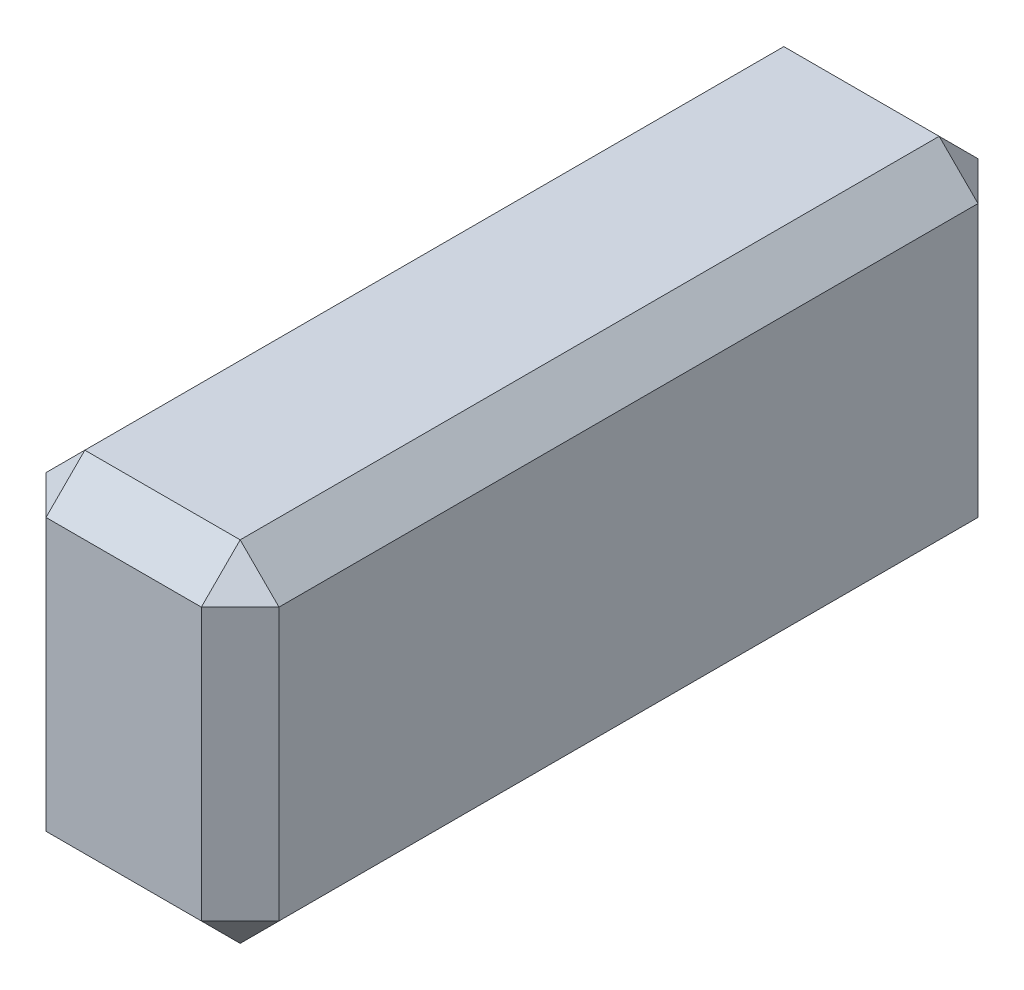
ISO-10303-21;
HEADER;
FILE_DESCRIPTION(('STEP AP214'),'2;1');
FILE_NAME('part.step','',(''),(''),'','','');
FILE_SCHEMA(('AUTOMOTIVE_DESIGN { 1 0 10303 214 1 1 1 1 }'));
ENDSEC;
DATA;
#1=APPLICATION_CONTEXT('core data for automotive mechanical design processes');
#2=APPLICATION_PROTOCOL_DEFINITION('international standard','automotive_design',2000,#1);
#3=PRODUCT_CONTEXT('',#1,'mechanical');
#4=PRODUCT('Part','Part','',(#3));
#5=PRODUCT_RELATED_PRODUCT_CATEGORY('part','',(#4));
#6=PRODUCT_DEFINITION_FORMATION('','',#4);
#7=PRODUCT_DEFINITION_CONTEXT('part definition',#1,'design');
#8=PRODUCT_DEFINITION('design','',#6,#7);
#9=PRODUCT_DEFINITION_SHAPE('','',#8);
#10=(LENGTH_UNIT() NAMED_UNIT(*) SI_UNIT(.MILLI.,.METRE.));
#11=(NAMED_UNIT(*) PLANE_ANGLE_UNIT() SI_UNIT($,.RADIAN.));
#12=(NAMED_UNIT(*) SI_UNIT($,.STERADIAN.) SOLID_ANGLE_UNIT());
#13=UNCERTAINTY_MEASURE_WITH_UNIT(LENGTH_MEASURE(1.E-05),#10,'distance_accuracy_value','');
#14=(GEOMETRIC_REPRESENTATION_CONTEXT(3) GLOBAL_UNCERTAINTY_ASSIGNED_CONTEXT((#13)) GLOBAL_UNIT_ASSIGNED_CONTEXT((#10,
#11,#12)) REPRESENTATION_CONTEXT('',''));
#15=CARTESIAN_POINT('',(0.,0.,0.));
#16=DIRECTION('',(0.,0.,1.));
#17=DIRECTION('',(1.,0.,0.));
#18=AXIS2_PLACEMENT_3D('',#15,#16,#17);
#19=CARTESIAN_POINT('',(1.5,-2.25,10.));
#20=DIRECTION('',(-1.,0.,0.));
#21=DIRECTION('',(0.,-1.,0.));
#22=AXIS2_PLACEMENT_3D('',#19,#20,#21);
#23=PLANE('',#22);
#24=DIRECTION('',(0.,-1.,0.));
#25=VECTOR('',#24,1.);
#26=CARTESIAN_POINT('',(1.5,-2.25,9.5));
#27=LINE('',#26,#25);
#28=CARTESIAN_POINT('',(1.5,1.75,9.5));
#29=VERTEX_POINT('',#28);
#30=CARTESIAN_POINT('',(1.5,-1.75,9.5));
#31=VERTEX_POINT('',#30);
#32=EDGE_CURVE('E51',#29,#31,#27,.T.);
#33=ORIENTED_EDGE('',*,*,#32,.T.);
#34=DIRECTION('',(0.,0.,-1.));
#35=VECTOR('',#34,1.);
#36=CARTESIAN_POINT('',(1.5,-1.75,10.));
#37=LINE('',#36,#35);
#38=CARTESIAN_POINT('',(1.5,-1.75,0.5));
#39=VERTEX_POINT('',#38);
#40=EDGE_CURVE('E11',#31,#39,#37,.T.);
#41=ORIENTED_EDGE('',*,*,#40,.T.);
#42=DIRECTION('',(0.,1.,0.));
#43=VECTOR('',#42,1.);
#44=CARTESIAN_POINT('',(1.5,2.25,0.5));
#45=LINE('',#44,#43);
#46=CARTESIAN_POINT('',(1.5,1.75,0.5));
#47=VERTEX_POINT('',#46);
#48=EDGE_CURVE('E203',#39,#47,#45,.T.);
#49=ORIENTED_EDGE('',*,*,#48,.T.);
#50=DIRECTION('',(0.,0.,1.));
#51=VECTOR('',#50,1.);
#52=CARTESIAN_POINT('',(1.5,1.75,10.));
#53=LINE('',#52,#51);
#54=EDGE_CURVE('E62',#47,#29,#53,.T.);
#55=ORIENTED_EDGE('',*,*,#54,.T.);
#56=EDGE_LOOP('',(#33,#41,#49,#55));
#57=FACE_BOUND('',#56,.T.);
#58=ADVANCED_FACE('F41',(#57),#23,.F.);
#59=CARTESIAN_POINT('',(-1.5,2.25,10.));
#60=DIRECTION('',(0.,-1.,0.));
#61=DIRECTION('',(1.,0.,0.));
#62=AXIS2_PLACEMENT_3D('',#59,#60,#61);
#63=PLANE('',#62);
#64=DIRECTION('',(0.,0.,1.));
#65=VECTOR('',#64,1.);
#66=CARTESIAN_POINT('',(-0.999999999999999,2.25,10.));
#67=LINE('',#66,#65);
#68=CARTESIAN_POINT('',(-0.999999999999999,2.25,0.5));
#69=VERTEX_POINT('',#68);
#70=CARTESIAN_POINT('',(-0.999999999999999,2.25,9.5));
#71=VERTEX_POINT('',#70);
#72=EDGE_CURVE('E189',#69,#71,#67,.T.);
#73=ORIENTED_EDGE('',*,*,#72,.T.);
#74=DIRECTION('',(1.,0.,0.));
#75=VECTOR('',#74,1.);
#76=CARTESIAN_POINT('',(-1.5,2.25,9.5));
#77=LINE('',#76,#75);
#78=CARTESIAN_POINT('',(0.999999999999998,2.25,9.5));
#79=VERTEX_POINT('',#78);
#80=EDGE_CURVE('E191',#71,#79,#77,.T.);
#81=ORIENTED_EDGE('',*,*,#80,.T.);
#82=DIRECTION('',(0.,0.,-1.));
#83=VECTOR('',#82,1.);
#84=CARTESIAN_POINT('',(0.999999999999998,2.25,10.));
#85=LINE('',#84,#83);
#86=CARTESIAN_POINT('',(0.999999999999998,2.25,0.5));
#87=VERTEX_POINT('',#86);
#88=EDGE_CURVE('E185',#79,#87,#85,.T.);
#89=ORIENTED_EDGE('',*,*,#88,.T.);
#90=DIRECTION('',(-1.,0.,0.));
#91=VECTOR('',#90,1.);
#92=CARTESIAN_POINT('',(-1.5,2.25,0.5));
#93=LINE('',#92,#91);
#94=EDGE_CURVE('E187',#87,#69,#93,.T.);
#95=ORIENTED_EDGE('',*,*,#94,.T.);
#96=EDGE_LOOP('',(#73,#81,#89,#95));
#97=FACE_BOUND('',#96,.T.);
#98=ADVANCED_FACE('F322',(#97),#63,.F.);
#99=CARTESIAN_POINT('',(-1.5,-2.25,10.));
#100=DIRECTION('',(1.,0.,0.));
#101=DIRECTION('',(0.,0.,-1.));
#102=AXIS2_PLACEMENT_3D('',#99,#100,#101);
#103=PLANE('',#102);
#104=DIRECTION('',(0.,1.,0.));
#105=VECTOR('',#104,1.);
#106=CARTESIAN_POINT('',(-1.5,-2.25,9.5));
#107=LINE('',#106,#105);
#108=CARTESIAN_POINT('',(-1.5,-1.75,9.5));
#109=VERTEX_POINT('',#108);
#110=CARTESIAN_POINT('',(-1.5,1.75,9.5));
#111=VERTEX_POINT('',#110);
#112=EDGE_CURVE('E198',#109,#111,#107,.T.);
#113=ORIENTED_EDGE('',*,*,#112,.T.);
#114=DIRECTION('',(0.,0.,-1.));
#115=VECTOR('',#114,1.);
#116=CARTESIAN_POINT('',(-1.5,1.75,10.));
#117=LINE('',#116,#115);
#118=CARTESIAN_POINT('',(-1.5,1.75,0.5));
#119=VERTEX_POINT('',#118);
#120=EDGE_CURVE('E200',#111,#119,#117,.T.);
#121=ORIENTED_EDGE('',*,*,#120,.T.);
#122=DIRECTION('',(0.,-1.,0.));
#123=VECTOR('',#122,1.);
#124=CARTESIAN_POINT('',(-1.5,-2.25,0.5));
#125=LINE('',#124,#123);
#126=CARTESIAN_POINT('',(-1.5,-1.75,0.5));
#127=VERTEX_POINT('',#126);
#128=EDGE_CURVE('E194',#119,#127,#125,.T.);
#129=ORIENTED_EDGE('',*,*,#128,.T.);
#130=DIRECTION('',(0.,0.,1.));
#131=VECTOR('',#130,1.);
#132=CARTESIAN_POINT('',(-1.5,-1.75,10.));
#133=LINE('',#132,#131);
#134=EDGE_CURVE('E196',#127,#109,#133,.T.);
#135=ORIENTED_EDGE('',*,*,#134,.T.);
#136=EDGE_LOOP('',(#113,#121,#129,#135));
#137=FACE_BOUND('',#136,.T.);
#138=ADVANCED_FACE('F278',(#137),#103,.F.);
#139=CARTESIAN_POINT('',(-1.5,-2.25,10.));
#140=DIRECTION('',(0.,1.,0.));
#141=DIRECTION('',(-1.,0.,0.));
#142=AXIS2_PLACEMENT_3D('',#139,#140,#141);
#143=PLANE('',#142);
#144=DIRECTION('',(-1.,0.,0.));
#145=VECTOR('',#144,1.);
#146=CARTESIAN_POINT('',(-1.5,-2.25,9.5));
#147=LINE('',#146,#145);
#148=CARTESIAN_POINT('',(0.999999999999997,-2.25,9.5));
#149=VERTEX_POINT('',#148);
#150=CARTESIAN_POINT('',(-1.,-2.25,9.5));
#151=VERTEX_POINT('',#150);
#152=EDGE_CURVE('E138',#149,#151,#147,.T.);
#153=ORIENTED_EDGE('',*,*,#152,.T.);
#154=DIRECTION('',(0.,0.,-1.));
#155=VECTOR('',#154,1.);
#156=CARTESIAN_POINT('',(-1.,-2.25,10.));
#157=LINE('',#156,#155);
#158=CARTESIAN_POINT('',(-1.,-2.25,0.5));
#159=VERTEX_POINT('',#158);
#160=EDGE_CURVE('E174',#151,#159,#157,.T.);
#161=ORIENTED_EDGE('',*,*,#160,.T.);
#162=DIRECTION('',(1.,0.,0.));
#163=VECTOR('',#162,1.);
#164=CARTESIAN_POINT('',(1.5,-2.25,0.5));
#165=LINE('',#164,#163);
#166=CARTESIAN_POINT('',(0.999999999999997,-2.25,0.5));
#167=VERTEX_POINT('',#166);
#168=EDGE_CURVE('E171',#159,#167,#165,.T.);
#169=ORIENTED_EDGE('',*,*,#168,.T.);
#170=DIRECTION('',(0.,0.,1.));
#171=VECTOR('',#170,1.);
#172=CARTESIAN_POINT('',(0.999999999999997,-2.25,10.));
#173=LINE('',#172,#171);
#174=EDGE_CURVE('E166',#167,#149,#173,.T.);
#175=ORIENTED_EDGE('',*,*,#174,.T.);
#176=EDGE_LOOP('',(#153,#161,#169,#175));
#177=FACE_BOUND('',#176,.T.);
#178=ADVANCED_FACE('F300',(#177),#143,.F.);
#179=CARTESIAN_POINT('',(0.,0.,10.));
#180=DIRECTION('',(0.,0.,-1.));
#181=DIRECTION('',(-1.,0.,0.));
#182=AXIS2_PLACEMENT_3D('',#179,#180,#181);
#183=PLANE('',#182);
#184=DIRECTION('',(-1.,0.,0.));
#185=VECTOR('',#184,1.);
#186=CARTESIAN_POINT('',(0.,1.75,10.));
#187=LINE('',#186,#185);
#188=CARTESIAN_POINT('',(0.999999999999998,1.75,10.));
#189=VERTEX_POINT('',#188);
#190=CARTESIAN_POINT('',(-1.,1.75,10.));
#191=VERTEX_POINT('',#190);
#192=EDGE_CURVE('E159',#189,#191,#187,.T.);
#193=ORIENTED_EDGE('',*,*,#192,.T.);
#194=DIRECTION('',(0.,-1.,0.));
#195=VECTOR('',#194,1.);
#196=CARTESIAN_POINT('',(-1.,0.,10.));
#197=LINE('',#196,#195);
#198=CARTESIAN_POINT('',(-1.,-1.75,10.));
#199=VERTEX_POINT('',#198);
#200=EDGE_CURVE('E163',#191,#199,#197,.T.);
#201=ORIENTED_EDGE('',*,*,#200,.T.);
#202=DIRECTION('',(1.,0.,0.));
#203=VECTOR('',#202,1.);
#204=CARTESIAN_POINT('',(0.,-1.75,10.));
#205=LINE('',#204,#203);
#206=CARTESIAN_POINT('',(0.999999999999997,-1.75,10.));
#207=VERTEX_POINT('',#206);
#208=EDGE_CURVE('E136',#199,#207,#205,.T.);
#209=ORIENTED_EDGE('',*,*,#208,.T.);
#210=DIRECTION('',(0.,1.,0.));
#211=VECTOR('',#210,1.);
#212=CARTESIAN_POINT('',(0.999999999999997,0.,10.));
#213=LINE('',#212,#211);
#214=EDGE_CURVE('E153',#207,#189,#213,.T.);
#215=ORIENTED_EDGE('',*,*,#214,.T.);
#216=EDGE_LOOP('',(#193,#201,#209,#215));
#217=FACE_BOUND('',#216,.T.);
#218=ADVANCED_FACE('F161',(#217),#183,.F.);
#219=CARTESIAN_POINT('',(0.,0.,0.));
#220=DIRECTION('',(0.,0.,-1.));
#221=DIRECTION('',(-1.,0.,0.));
#222=AXIS2_PLACEMENT_3D('',#219,#220,#221);
#223=PLANE('',#222);
#224=DIRECTION('',(0.,-1.,0.));
#225=VECTOR('',#224,1.);
#226=CARTESIAN_POINT('',(0.999999999999997,-2.25,0.));
#227=LINE('',#226,#225);
#228=CARTESIAN_POINT('',(0.999999999999998,1.75,0.));
#229=VERTEX_POINT('',#228);
#230=CARTESIAN_POINT('',(0.999999999999997,-1.75,0.));
#231=VERTEX_POINT('',#230);
#232=EDGE_CURVE('E176',#229,#231,#227,.T.);
#233=ORIENTED_EDGE('',*,*,#232,.T.);
#234=DIRECTION('',(-1.,0.,0.));
#235=VECTOR('',#234,1.);
#236=CARTESIAN_POINT('',(-1.5,-1.75,0.));
#237=LINE('',#236,#235);
#238=CARTESIAN_POINT('',(-0.999999999999999,-1.75,0.));
#239=VERTEX_POINT('',#238);
#240=EDGE_CURVE('E182',#231,#239,#237,.T.);
#241=ORIENTED_EDGE('',*,*,#240,.T.);
#242=DIRECTION('',(0.,1.,0.));
#243=VECTOR('',#242,1.);
#244=CARTESIAN_POINT('',(-0.999999999999999,2.25,0.));
#245=LINE('',#244,#243);
#246=CARTESIAN_POINT('',(-0.999999999999999,1.75,0.));
#247=VERTEX_POINT('',#246);
#248=EDGE_CURVE('E180',#239,#247,#245,.T.);
#249=ORIENTED_EDGE('',*,*,#248,.T.);
#250=DIRECTION('',(1.,0.,0.));
#251=VECTOR('',#250,1.);
#252=CARTESIAN_POINT('',(1.5,1.75,0.));
#253=LINE('',#252,#251);
#254=EDGE_CURVE('E178',#247,#229,#253,.T.);
#255=ORIENTED_EDGE('',*,*,#254,.T.);
#256=EDGE_LOOP('',(#233,#241,#249,#255));
#257=FACE_BOUND('',#256,.T.);
#258=ADVANCED_FACE('F324',(#257),#223,.T.);
#259=CARTESIAN_POINT('',(-1.5,2.25,0.5));
#260=DIRECTION('',(0.,0.707106781186546,-0.707106781186549));
#261=DIRECTION('',(1.,0.,0.));
#262=AXIS2_PLACEMENT_3D('',#259,#260,#261);
#263=PLANE('',#262);
#264=DIRECTION('',(0.,-0.707106781186549,-0.707106781186546));
#265=VECTOR('',#264,1.);
#266=CARTESIAN_POINT('',(-0.999999999999999,2.,0.25));
#267=LINE('',#266,#265);
#268=EDGE_CURVE('E46',#69,#247,#267,.T.);
#269=ORIENTED_EDGE('',*,*,#268,.F.);
#270=ORIENTED_EDGE('',*,*,#94,.F.);
#271=DIRECTION('',(0.,0.707106781186549,0.707106781186546));
#272=VECTOR('',#271,1.);
#273=CARTESIAN_POINT('',(0.999999999999998,1.75,0.));
#274=LINE('',#273,#272);
#275=EDGE_CURVE('E256',#229,#87,#274,.T.);
#276=ORIENTED_EDGE('',*,*,#275,.F.);
#277=ORIENTED_EDGE('',*,*,#254,.F.);
#278=EDGE_LOOP('',(#269,#270,#276,#277));
#279=FACE_BOUND('',#278,.T.);
#280=ADVANCED_FACE('F44',(#279),#263,.T.);
#281=CARTESIAN_POINT('',(-1.5,1.75,0.5));
#282=DIRECTION('',(-0.577350269189624,0.577350269189626,-0.577350269189628));
#283=DIRECTION('',(0.,0.707106781186549,0.707106781186546));
#284=AXIS2_PLACEMENT_3D('',#281,#282,#283);
#285=PLANE('',#284);
#286=DIRECTION('',(-0.707106781186549,-0.707106781186546,0.));
#287=VECTOR('',#286,1.);
#288=CARTESIAN_POINT('',(-1.5,1.75,0.5));
#289=LINE('',#288,#287);
#290=EDGE_CURVE('E251',#69,#119,#289,.T.);
#291=ORIENTED_EDGE('',*,*,#290,.F.);
#292=ORIENTED_EDGE('',*,*,#268,.T.);
#293=DIRECTION('',(-0.707106781186549,0.,0.707106781186546));
#294=VECTOR('',#293,1.);
#295=CARTESIAN_POINT('',(-1.5,1.75,0.5));
#296=LINE('',#295,#294);
#297=EDGE_CURVE('E254',#119,#247,#296,.F.);
#298=ORIENTED_EDGE('',*,*,#297,.F.);
#299=EDGE_LOOP('',(#291,#292,#298));
#300=FACE_BOUND('',#299,.T.);
#301=ADVANCED_FACE('F267',(#300),#285,.T.);
#302=CARTESIAN_POINT('',(0.999999999999998,1.75,0.));
#303=DIRECTION('',(0.577350269189625,0.577350269189626,-0.577350269189627));
#304=DIRECTION('',(0.,0.707106781186549,0.707106781186546));
#305=AXIS2_PLACEMENT_3D('',#302,#303,#304);
#306=PLANE('',#305);
#307=DIRECTION('',(-0.707106781186549,0.,-0.707106781186546));
#308=VECTOR('',#307,1.);
#309=CARTESIAN_POINT('',(0.999999999999998,1.75,0.));
#310=LINE('',#309,#308);
#311=EDGE_CURVE('E245',#229,#47,#310,.F.);
#312=ORIENTED_EDGE('',*,*,#311,.F.);
#313=ORIENTED_EDGE('',*,*,#275,.T.);
#314=DIRECTION('',(-0.707106781186548,0.707106781186547,0.));
#315=VECTOR('',#314,1.);
#316=CARTESIAN_POINT('',(1.25,2.,0.500000000000001));
#317=LINE('',#316,#315);
#318=EDGE_CURVE('E248',#47,#87,#317,.T.);
#319=ORIENTED_EDGE('',*,*,#318,.F.);
#320=EDGE_LOOP('',(#312,#313,#319));
#321=FACE_BOUND('',#320,.T.);
#322=ADVANCED_FACE('F311',(#321),#306,.T.);
#323=CARTESIAN_POINT('',(-1.5,-2.25,0.5));
#324=DIRECTION('',(-0.707106781186546,0.,-0.707106781186549));
#325=DIRECTION('',(0.,1.,0.));
#326=AXIS2_PLACEMENT_3D('',#323,#324,#325);
#327=PLANE('',#326);
#328=ORIENTED_EDGE('',*,*,#297,.T.);
#329=ORIENTED_EDGE('',*,*,#248,.F.);
#330=DIRECTION('',(0.707106781186549,0.,-0.707106781186546));
#331=VECTOR('',#330,1.);
#332=CARTESIAN_POINT('',(-0.999999999999999,-1.75,0.));
#333=LINE('',#332,#331);
#334=EDGE_CURVE('E240',#127,#239,#333,.T.);
#335=ORIENTED_EDGE('',*,*,#334,.F.);
#336=ORIENTED_EDGE('',*,*,#128,.F.);
#337=EDGE_LOOP('',(#328,#329,#335,#336));
#338=FACE_BOUND('',#337,.T.);
#339=ADVANCED_FACE('F274',(#338),#327,.T.);
#340=CARTESIAN_POINT('',(-1.5,1.75,10.));
#341=DIRECTION('',(0.707106781186546,-0.707106781186549,0.));
#342=DIRECTION('',(0.,0.,-1.));
#343=AXIS2_PLACEMENT_3D('',#340,#341,#342);
#344=PLANE('',#343);
#345=ORIENTED_EDGE('',*,*,#290,.T.);
#346=ORIENTED_EDGE('',*,*,#120,.F.);
#347=DIRECTION('',(0.707106781186549,0.707106781186546,0.));
#348=VECTOR('',#347,1.);
#349=CARTESIAN_POINT('',(-1.25,2.,9.5));
#350=LINE('',#349,#348);
#351=EDGE_CURVE('E237',#71,#111,#350,.F.);
#352=ORIENTED_EDGE('',*,*,#351,.F.);
#353=ORIENTED_EDGE('',*,*,#72,.F.);
#354=EDGE_LOOP('',(#345,#346,#352,#353));
#355=FACE_BOUND('',#354,.T.);
#356=ADVANCED_FACE('F284',(#355),#344,.F.);
#357=CARTESIAN_POINT('',(0.,1.75,10.));
#358=DIRECTION('',(0.,-0.707106781186549,-0.707106781186546));
#359=DIRECTION('',(-1.,0.,0.));
#360=AXIS2_PLACEMENT_3D('',#357,#358,#359);
#361=PLANE('',#360);
#362=DIRECTION('',(0.,0.707106781186546,-0.707106781186549));
#363=VECTOR('',#362,1.);
#364=CARTESIAN_POINT('',(0.999999999999998,2.25,9.5));
#365=LINE('',#364,#363);
#366=EDGE_CURVE('E231',#79,#189,#365,.F.);
#367=ORIENTED_EDGE('',*,*,#366,.F.);
#368=ORIENTED_EDGE('',*,*,#80,.F.);
#369=DIRECTION('',(0.,-0.707106781186546,0.707106781186549));
#370=VECTOR('',#369,1.);
#371=CARTESIAN_POINT('',(-1.,1.75,10.));
#372=LINE('',#371,#370);
#373=EDGE_CURVE('E234',#191,#71,#372,.F.);
#374=ORIENTED_EDGE('',*,*,#373,.F.);
#375=ORIENTED_EDGE('',*,*,#192,.F.);
#376=EDGE_LOOP('',(#367,#368,#374,#375));
#377=FACE_BOUND('',#376,.T.);
#378=ADVANCED_FACE('F320',(#377),#361,.F.);
#379=CARTESIAN_POINT('',(0.999999999999998,2.25,10.));
#380=DIRECTION('',(-0.707106781186547,-0.707106781186548,0.));
#381=DIRECTION('',(0.,0.,-1.));
#382=AXIS2_PLACEMENT_3D('',#379,#380,#381);
#383=PLANE('',#382);
#384=ORIENTED_EDGE('',*,*,#318,.T.);
#385=ORIENTED_EDGE('',*,*,#88,.F.);
#386=DIRECTION('',(0.707106781186548,-0.707106781186547,0.));
#387=VECTOR('',#386,1.);
#388=CARTESIAN_POINT('',(0.999999999999998,2.25,9.5));
#389=LINE('',#388,#387);
#390=EDGE_CURVE('E229',#29,#79,#389,.F.);
#391=ORIENTED_EDGE('',*,*,#390,.F.);
#392=ORIENTED_EDGE('',*,*,#54,.F.);
#393=EDGE_LOOP('',(#384,#385,#391,#392));
#394=FACE_BOUND('',#393,.T.);
#395=ADVANCED_FACE('F314',(#394),#383,.F.);
#396=CARTESIAN_POINT('',(1.5,-2.25,0.5));
#397=DIRECTION('',(0.707106781186546,0.,-0.707106781186549));
#398=DIRECTION('',(0.,-1.,0.));
#399=AXIS2_PLACEMENT_3D('',#396,#397,#398);
#400=PLANE('',#399);
#401=ORIENTED_EDGE('',*,*,#311,.T.);
#402=ORIENTED_EDGE('',*,*,#48,.F.);
#403=DIRECTION('',(0.707106781186549,0.,0.707106781186546));
#404=VECTOR('',#403,1.);
#405=CARTESIAN_POINT('',(1.25,-1.75,0.25));
#406=LINE('',#405,#404);
#407=EDGE_CURVE('E226',#231,#39,#406,.T.);
#408=ORIENTED_EDGE('',*,*,#407,.F.);
#409=ORIENTED_EDGE('',*,*,#232,.F.);
#410=EDGE_LOOP('',(#401,#402,#408,#409));
#411=FACE_BOUND('',#410,.T.);
#412=ADVANCED_FACE('F310',(#411),#400,.T.);
#413=CARTESIAN_POINT('',(-1.5,-2.25,0.5));
#414=DIRECTION('',(0.,-0.707106781186546,-0.707106781186549));
#415=DIRECTION('',(-1.,0.,0.));
#416=AXIS2_PLACEMENT_3D('',#413,#414,#415);
#417=PLANE('',#416);
#418=DIRECTION('',(0.,-0.707106781186549,0.707106781186546));
#419=VECTOR('',#418,1.);
#420=CARTESIAN_POINT('',(-0.999999999999999,-1.75,0.));
#421=LINE('',#420,#419);
#422=EDGE_CURVE('E242',#239,#159,#421,.T.);
#423=ORIENTED_EDGE('',*,*,#422,.F.);
#424=ORIENTED_EDGE('',*,*,#240,.F.);
#425=DIRECTION('',(0.,0.707106781186549,-0.707106781186546));
#426=VECTOR('',#425,1.);
#427=CARTESIAN_POINT('',(0.999999999999997,-2.25,0.5));
#428=LINE('',#427,#426);
#429=EDGE_CURVE('E223',#167,#231,#428,.T.);
#430=ORIENTED_EDGE('',*,*,#429,.F.);
#431=ORIENTED_EDGE('',*,*,#168,.F.);
#432=EDGE_LOOP('',(#423,#424,#430,#431));
#433=FACE_BOUND('',#432,.T.);
#434=ADVANCED_FACE('F328',(#433),#417,.T.);
#435=CARTESIAN_POINT('',(-0.999999999999999,-1.75,0.));
#436=DIRECTION('',(-0.577350269189626,-0.577350269189624,-0.577350269189628));
#437=DIRECTION('',(-0.707106781186549,0.,0.707106781186546));
#438=AXIS2_PLACEMENT_3D('',#435,#436,#437);
#439=PLANE('',#438);
#440=ORIENTED_EDGE('',*,*,#334,.T.);
#441=ORIENTED_EDGE('',*,*,#422,.T.);
#442=DIRECTION('',(0.707106781186546,-0.707106781186549,0.));
#443=VECTOR('',#442,1.);
#444=CARTESIAN_POINT('',(-1.25,-2.,0.500000000000001));
#445=LINE('',#444,#443);
#446=EDGE_CURVE('E220',#127,#159,#445,.T.);
#447=ORIENTED_EDGE('',*,*,#446,.F.);
#448=EDGE_LOOP('',(#440,#441,#447));
#449=FACE_BOUND('',#448,.T.);
#450=ADVANCED_FACE('F394',(#449),#439,.T.);
#451=CARTESIAN_POINT('',(-1.,1.75,10.));
#452=DIRECTION('',(-0.577350269189626,0.577350269189628,0.577350269189624));
#453=DIRECTION('',(-0.707106781186549,-0.707106781186546,0.));
#454=AXIS2_PLACEMENT_3D('',#451,#452,#453);
#455=PLANE('',#454);
#456=ORIENTED_EDGE('',*,*,#373,.T.);
#457=ORIENTED_EDGE('',*,*,#351,.T.);
#458=DIRECTION('',(-0.707106781186546,0.,-0.707106781186549));
#459=VECTOR('',#458,1.);
#460=CARTESIAN_POINT('',(-1.,1.75,10.));
#461=LINE('',#460,#459);
#462=EDGE_CURVE('E217',#191,#111,#461,.T.);
#463=ORIENTED_EDGE('',*,*,#462,.F.);
#464=EDGE_LOOP('',(#456,#457,#463));
#465=FACE_BOUND('',#464,.T.);
#466=ADVANCED_FACE('F287',(#465),#455,.T.);
#467=CARTESIAN_POINT('',(0.999999999999998,2.25,9.5));
#468=DIRECTION('',(0.577350269189625,0.577350269189627,0.577350269189626));
#469=DIRECTION('',(0.,-0.707106781186546,0.707106781186549));
#470=AXIS2_PLACEMENT_3D('',#467,#468,#469);
#471=PLANE('',#470);
#472=ORIENTED_EDGE('',*,*,#390,.T.);
#473=ORIENTED_EDGE('',*,*,#366,.T.);
#474=DIRECTION('',(-0.707106781186549,0.,0.707106781186546));
#475=VECTOR('',#474,1.);
#476=CARTESIAN_POINT('',(1.25,1.75,9.75));
#477=LINE('',#476,#475);
#478=EDGE_CURVE('E156',#29,#189,#477,.T.);
#479=ORIENTED_EDGE('',*,*,#478,.F.);
#480=EDGE_LOOP('',(#472,#473,#479));
#481=FACE_BOUND('',#480,.T.);
#482=ADVANCED_FACE('F317',(#481),#471,.T.);
#483=CARTESIAN_POINT('',(0.999999999999997,-2.25,0.5));
#484=DIRECTION('',(0.577350269189624,-0.577350269189626,-0.577350269189628));
#485=DIRECTION('',(0.,0.707106781186549,-0.707106781186546));
#486=AXIS2_PLACEMENT_3D('',#483,#484,#485);
#487=PLANE('',#486);
#488=ORIENTED_EDGE('',*,*,#429,.T.);
#489=ORIENTED_EDGE('',*,*,#407,.T.);
#490=DIRECTION('',(0.707106781186549,0.707106781186546,0.));
#491=VECTOR('',#490,1.);
#492=CARTESIAN_POINT('',(0.999999999999997,-2.25,0.5));
#493=LINE('',#492,#491);
#494=EDGE_CURVE('E214',#167,#39,#493,.T.);
#495=ORIENTED_EDGE('',*,*,#494,.F.);
#496=EDGE_LOOP('',(#488,#489,#495));
#497=FACE_BOUND('',#496,.T.);
#498=ADVANCED_FACE('F330',(#497),#487,.T.);
#499=CARTESIAN_POINT('',(-1.,-2.25,10.));
#500=DIRECTION('',(0.707106781186549,0.707106781186546,0.));
#501=DIRECTION('',(0.,0.,-1.));
#502=AXIS2_PLACEMENT_3D('',#499,#500,#501);
#503=PLANE('',#502);
#504=ORIENTED_EDGE('',*,*,#446,.T.);
#505=ORIENTED_EDGE('',*,*,#160,.F.);
#506=DIRECTION('',(-0.707106781186546,0.707106781186549,0.));
#507=VECTOR('',#506,1.);
#508=CARTESIAN_POINT('',(-1.,-2.25,9.5));
#509=LINE('',#508,#507);
#510=EDGE_CURVE('E211',#109,#151,#509,.F.);
#511=ORIENTED_EDGE('',*,*,#510,.F.);
#512=ORIENTED_EDGE('',*,*,#134,.F.);
#513=EDGE_LOOP('',(#504,#505,#511,#512));
#514=FACE_BOUND('',#513,.T.);
#515=ADVANCED_FACE('F297',(#514),#503,.F.);
#516=CARTESIAN_POINT('',(-1.,0.,10.));
#517=DIRECTION('',(0.707106781186549,0.,-0.707106781186546));
#518=DIRECTION('',(0.,-1.,0.));
#519=AXIS2_PLACEMENT_3D('',#516,#517,#518);
#520=PLANE('',#519);
#521=ORIENTED_EDGE('',*,*,#462,.T.);
#522=ORIENTED_EDGE('',*,*,#112,.F.);
#523=DIRECTION('',(0.707106781186546,0.,0.707106781186549));
#524=VECTOR('',#523,1.);
#525=CARTESIAN_POINT('',(-1.25,-1.75,9.75));
#526=LINE('',#525,#524);
#527=EDGE_CURVE('E150',#199,#109,#526,.F.);
#528=ORIENTED_EDGE('',*,*,#527,.F.);
#529=ORIENTED_EDGE('',*,*,#200,.F.);
#530=EDGE_LOOP('',(#521,#522,#528,#529));
#531=FACE_BOUND('',#530,.T.);
#532=ADVANCED_FACE('F290',(#531),#520,.F.);
#533=CARTESIAN_POINT('',(0.999999999999997,0.,10.));
#534=DIRECTION('',(-0.707106781186546,0.,-0.707106781186549));
#535=DIRECTION('',(0.,1.,0.));
#536=AXIS2_PLACEMENT_3D('',#533,#534,#535);
#537=PLANE('',#536);
#538=ORIENTED_EDGE('',*,*,#478,.T.);
#539=ORIENTED_EDGE('',*,*,#214,.F.);
#540=DIRECTION('',(0.707106781186549,0.,-0.707106781186546));
#541=VECTOR('',#540,1.);
#542=CARTESIAN_POINT('',(0.999999999999997,-1.75,10.));
#543=LINE('',#542,#541);
#544=EDGE_CURVE('E144',#31,#207,#543,.F.);
#545=ORIENTED_EDGE('',*,*,#544,.F.);
#546=ORIENTED_EDGE('',*,*,#32,.F.);
#547=EDGE_LOOP('',(#538,#539,#545,#546));
#548=FACE_BOUND('',#547,.T.);
#549=ADVANCED_FACE('F154',(#548),#537,.F.);
#550=CARTESIAN_POINT('',(1.5,-1.75,10.));
#551=DIRECTION('',(-0.707106781186546,0.707106781186549,0.));
#552=DIRECTION('',(0.,0.,-1.));
#553=AXIS2_PLACEMENT_3D('',#550,#551,#552);
#554=PLANE('',#553);
#555=ORIENTED_EDGE('',*,*,#494,.T.);
#556=ORIENTED_EDGE('',*,*,#40,.F.);
#557=DIRECTION('',(-0.707106781186549,-0.707106781186546,0.));
#558=VECTOR('',#557,1.);
#559=CARTESIAN_POINT('',(1.25,-2.,9.5));
#560=LINE('',#559,#558);
#561=EDGE_CURVE('E148',#149,#31,#560,.F.);
#562=ORIENTED_EDGE('',*,*,#561,.F.);
#563=ORIENTED_EDGE('',*,*,#174,.F.);
#564=EDGE_LOOP('',(#555,#556,#562,#563));
#565=FACE_BOUND('',#564,.T.);
#566=ADVANCED_FACE('F304',(#565),#554,.F.);
#567=CARTESIAN_POINT('',(-1.,-2.25,9.5));
#568=DIRECTION('',(-0.577350269189628,-0.577350269189626,0.577350269189624));
#569=DIRECTION('',(0.707106781186546,-0.707106781186549,0.));
#570=AXIS2_PLACEMENT_3D('',#567,#568,#569);
#571=PLANE('',#570);
#572=ORIENTED_EDGE('',*,*,#527,.T.);
#573=ORIENTED_EDGE('',*,*,#510,.T.);
#574=DIRECTION('',(0.,-0.707106781186546,-0.707106781186549));
#575=VECTOR('',#574,1.);
#576=CARTESIAN_POINT('',(-1.,-2.25,9.5));
#577=LINE('',#576,#575);
#578=EDGE_CURVE('E141',#199,#151,#577,.T.);
#579=ORIENTED_EDGE('',*,*,#578,.F.);
#580=EDGE_LOOP('',(#572,#573,#579));
#581=FACE_BOUND('',#580,.T.);
#582=ADVANCED_FACE('F294',(#581),#571,.T.);
#583=CARTESIAN_POINT('',(0.999999999999997,-1.75,10.));
#584=DIRECTION('',(0.577350269189624,-0.577350269189628,0.577350269189626));
#585=DIRECTION('',(0.,-0.707106781186546,-0.707106781186549));
#586=AXIS2_PLACEMENT_3D('',#583,#584,#585);
#587=PLANE('',#586);
#588=ORIENTED_EDGE('',*,*,#561,.T.);
#589=ORIENTED_EDGE('',*,*,#544,.T.);
#590=DIRECTION('',(0.,0.707106781186546,0.707106781186549));
#591=VECTOR('',#590,1.);
#592=CARTESIAN_POINT('',(0.999999999999997,-1.75,10.));
#593=LINE('',#592,#591);
#594=EDGE_CURVE('E132',#149,#207,#593,.T.);
#595=ORIENTED_EDGE('',*,*,#594,.F.);
#596=EDGE_LOOP('',(#588,#589,#595));
#597=FACE_BOUND('',#596,.T.);
#598=ADVANCED_FACE('F146',(#597),#587,.T.);
#599=CARTESIAN_POINT('',(0.,-1.75,10.));
#600=DIRECTION('',(0.,0.707106781186549,-0.707106781186546));
#601=DIRECTION('',(1.,0.,0.));
#602=AXIS2_PLACEMENT_3D('',#599,#600,#601);
#603=PLANE('',#602);
#604=ORIENTED_EDGE('',*,*,#578,.T.);
#605=ORIENTED_EDGE('',*,*,#152,.F.);
#606=ORIENTED_EDGE('',*,*,#594,.T.);
#607=ORIENTED_EDGE('',*,*,#208,.F.);
#608=EDGE_LOOP('',(#604,#605,#606,#607));
#609=FACE_BOUND('',#608,.T.);
#610=ADVANCED_FACE('F134',(#609),#603,.F.);
#611=CLOSED_SHELL('',(#58,#98,#138,#178,#218,#258,#280,#301,#322,#339,#356,#378,#395,#412,#434,
#450,#466,#482,#498,#515,#532,#549,#566,#582,#598,#610));
#612=MANIFOLD_SOLID_BREP('B2',#611);
#613=ADVANCED_BREP_SHAPE_REPRESENTATION('',(#18,#612),#14);
#614=SHAPE_DEFINITION_REPRESENTATION(#9,#613);
ENDSEC;
END-ISO-10303-21;
